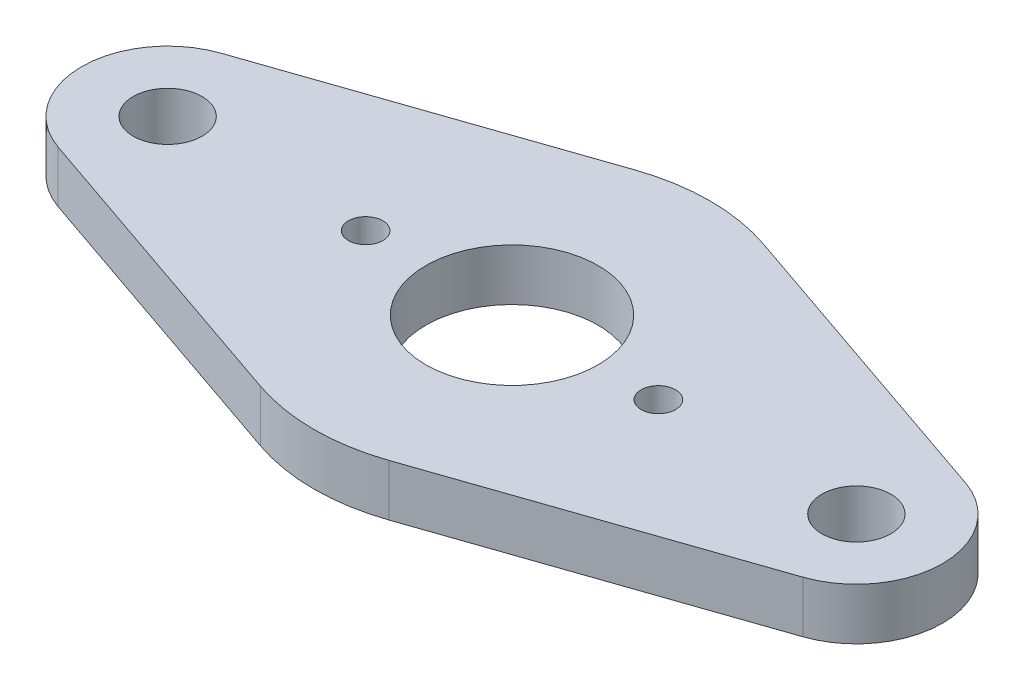
ISO-10303-21;
HEADER;
FILE_DESCRIPTION(('STEP AP214'),'2;1');
FILE_NAME('part.step','',(''),(''),'','','');
FILE_SCHEMA(('AUTOMOTIVE_DESIGN { 1 0 10303 214 1 1 1 1 }'));
ENDSEC;
DATA;
#1=APPLICATION_CONTEXT('core data for automotive mechanical design processes');
#2=APPLICATION_PROTOCOL_DEFINITION('international standard','automotive_design',2000,#1);
#3=PRODUCT_CONTEXT('',#1,'mechanical');
#4=PRODUCT('Part','Part','',(#3));
#5=PRODUCT_RELATED_PRODUCT_CATEGORY('part','',(#4));
#6=PRODUCT_DEFINITION_FORMATION('','',#4);
#7=PRODUCT_DEFINITION_CONTEXT('part definition',#1,'design');
#8=PRODUCT_DEFINITION('design','',#6,#7);
#9=PRODUCT_DEFINITION_SHAPE('','',#8);
#10=(LENGTH_UNIT() NAMED_UNIT(*) SI_UNIT(.MILLI.,.METRE.));
#11=(NAMED_UNIT(*) PLANE_ANGLE_UNIT() SI_UNIT($,.RADIAN.));
#12=(NAMED_UNIT(*) SI_UNIT($,.STERADIAN.) SOLID_ANGLE_UNIT());
#13=UNCERTAINTY_MEASURE_WITH_UNIT(LENGTH_MEASURE(1.E-05),#10,'distance_accuracy_value','');
#14=(GEOMETRIC_REPRESENTATION_CONTEXT(3) GLOBAL_UNCERTAINTY_ASSIGNED_CONTEXT((#13)) GLOBAL_UNIT_ASSIGNED_CONTEXT((#10,
#11,#12)) REPRESENTATION_CONTEXT('',''));
#15=CARTESIAN_POINT('',(0.,0.,0.));
#16=DIRECTION('',(0.,0.,1.));
#17=DIRECTION('',(1.,0.,0.));
#18=AXIS2_PLACEMENT_3D('',#15,#16,#17);
#19=CARTESIAN_POINT('',(-20.,3.,0.));
#20=DIRECTION('',(0.,1.,0.));
#21=DIRECTION('',(0.,0.,1.));
#22=AXIS2_PLACEMENT_3D('',#19,#20,#21);
#23=PLANE('',#22);
#24=CARTESIAN_POINT('',(20.,3.,0.));
#25=DIRECTION('',(0.,1.,0.));
#26=DIRECTION('',(0.,0.,-1.));
#27=AXIS2_PLACEMENT_3D('',#24,#25,#26);
#28=CIRCLE('',#27,2.);
#29=CARTESIAN_POINT('',(20.,3.,-2.));
#30=VERTEX_POINT('',#29);
#31=EDGE_CURVE('E198',#30,#30,#28,.T.);
#32=ORIENTED_EDGE('',*,*,#31,.F.);
#33=EDGE_LOOP('',(#32));
#34=FACE_BOUND('',#33,.T.);
#35=CARTESIAN_POINT('',(-20.,3.,0.));
#36=DIRECTION('',(0.,1.,0.));
#37=DIRECTION('',(0.,0.,1.));
#38=AXIS2_PLACEMENT_3D('',#35,#36,#37);
#39=CIRCLE('',#38,2.);
#40=CARTESIAN_POINT('',(-20.,3.,2.));
#41=VERTEX_POINT('',#40);
#42=EDGE_CURVE('E186',#41,#41,#39,.T.);
#43=ORIENTED_EDGE('',*,*,#42,.F.);
#44=EDGE_LOOP('',(#43));
#45=FACE_BOUND('',#44,.T.);
#46=CARTESIAN_POINT('',(-20.,3.,0.));
#47=DIRECTION('',(0.,1.,0.));
#48=DIRECTION('',(0.,0.,1.));
#49=AXIS2_PLACEMENT_3D('',#46,#47,#48);
#50=CIRCLE('',#49,5.);
#51=CARTESIAN_POINT('',(-21.625,3.,-4.72857007984443));
#52=VERTEX_POINT('',#51);
#53=CARTESIAN_POINT('',(-21.625,3.,4.72857007984444));
#54=VERTEX_POINT('',#53);
#55=EDGE_CURVE('E149',#52,#54,#50,.T.);
#56=ORIENTED_EDGE('',*,*,#55,.T.);
#57=DIRECTION('',(0.945714015968887,0.,0.325));
#58=VECTOR('',#57,1.);
#59=CARTESIAN_POINT('',(-21.625,3.,4.72857007984444));
#60=LINE('',#59,#58);
#61=CARTESIAN_POINT('',(-3.7375,3.,10.8757111836422));
#62=VERTEX_POINT('',#61);
#63=EDGE_CURVE('E97',#54,#62,#60,.T.);
#64=ORIENTED_EDGE('',*,*,#63,.T.);
#65=CARTESIAN_POINT('',(0.,3.,0.));
#66=DIRECTION('',(0.,1.,0.));
#67=DIRECTION('',(0.,0.,1.));
#68=AXIS2_PLACEMENT_3D('',#65,#66,#67);
#69=CIRCLE('',#68,11.5);
#70=CARTESIAN_POINT('',(3.7375,3.,10.8757111836422));
#71=VERTEX_POINT('',#70);
#72=EDGE_CURVE('E164',#62,#71,#69,.T.);
#73=ORIENTED_EDGE('',*,*,#72,.T.);
#74=DIRECTION('',(0.945714015968887,0.,-0.325));
#75=VECTOR('',#74,1.);
#76=CARTESIAN_POINT('',(21.625,3.,4.72857007984444));
#77=LINE('',#76,#75);
#78=CARTESIAN_POINT('',(21.625,3.,4.72857007984444));
#79=VERTEX_POINT('',#78);
#80=EDGE_CURVE('E177',#71,#79,#77,.T.);
#81=ORIENTED_EDGE('',*,*,#80,.T.);
#82=CARTESIAN_POINT('',(20.,3.,0.));
#83=DIRECTION('',(0.,1.,0.));
#84=DIRECTION('',(0.,0.,-1.));
#85=AXIS2_PLACEMENT_3D('',#82,#83,#84);
#86=CIRCLE('',#85,5.);
#87=CARTESIAN_POINT('',(21.625,3.,-4.72857007984443));
#88=VERTEX_POINT('',#87);
#89=EDGE_CURVE('E116',#79,#88,#86,.T.);
#90=ORIENTED_EDGE('',*,*,#89,.T.);
#91=DIRECTION('',(-0.945714015968887,0.,-0.325));
#92=VECTOR('',#91,1.);
#93=CARTESIAN_POINT('',(21.625,3.,-4.72857007984443));
#94=LINE('',#93,#92);
#95=CARTESIAN_POINT('',(3.7375,3.,-10.8757111836422));
#96=VERTEX_POINT('',#95);
#97=EDGE_CURVE('E110',#88,#96,#94,.T.);
#98=ORIENTED_EDGE('',*,*,#97,.T.);
#99=CARTESIAN_POINT('',(0.,3.,0.));
#100=DIRECTION('',(0.,1.,0.));
#101=DIRECTION('',(0.,0.,1.));
#102=AXIS2_PLACEMENT_3D('',#99,#100,#101);
#103=CIRCLE('',#102,11.5);
#104=CARTESIAN_POINT('',(-3.7375,3.,-10.8757111836422));
#105=VERTEX_POINT('',#104);
#106=EDGE_CURVE('E114',#96,#105,#103,.T.);
#107=ORIENTED_EDGE('',*,*,#106,.T.);
#108=DIRECTION('',(-0.945714015968887,0.,0.325));
#109=VECTOR('',#108,1.);
#110=CARTESIAN_POINT('',(-21.625,3.,-4.72857007984443));
#111=LINE('',#110,#109);
#112=EDGE_CURVE('E54',#105,#52,#111,.T.);
#113=ORIENTED_EDGE('',*,*,#112,.T.);
#114=EDGE_LOOP('',(#56,#64,#73,#81,#90,#98,#107,#113));
#115=FACE_BOUND('',#114,.T.);
#116=CARTESIAN_POINT('',(8.5,3.,0.));
#117=DIRECTION('',(0.,1.,0.));
#118=DIRECTION('',(0.,0.,-1.));
#119=AXIS2_PLACEMENT_3D('',#116,#117,#118);
#120=CIRCLE('',#119,1.);
#121=CARTESIAN_POINT('',(8.5,3.,-1.));
#122=VERTEX_POINT('',#121);
#123=EDGE_CURVE('E138',#122,#122,#120,.T.);
#124=ORIENTED_EDGE('',*,*,#123,.F.);
#125=EDGE_LOOP('',(#124));
#126=FACE_BOUND('',#125,.T.);
#127=CARTESIAN_POINT('',(-8.5,3.,0.));
#128=DIRECTION('',(0.,1.,0.));
#129=DIRECTION('',(0.,0.,1.));
#130=AXIS2_PLACEMENT_3D('',#127,#128,#129);
#131=CIRCLE('',#130,1.);
#132=CARTESIAN_POINT('',(-8.5,3.,1.));
#133=VERTEX_POINT('',#132);
#134=EDGE_CURVE('E192',#133,#133,#131,.T.);
#135=ORIENTED_EDGE('',*,*,#134,.F.);
#136=EDGE_LOOP('',(#135));
#137=FACE_BOUND('',#136,.T.);
#138=CARTESIAN_POINT('',(0.,3.,0.));
#139=DIRECTION('',(0.,1.,0.));
#140=DIRECTION('',(0.,0.,1.));
#141=AXIS2_PLACEMENT_3D('',#138,#139,#140);
#142=CIRCLE('',#141,5.);
#143=CARTESIAN_POINT('',(0.,3.,5.));
#144=VERTEX_POINT('',#143);
#145=EDGE_CURVE('E204',#144,#144,#142,.T.);
#146=ORIENTED_EDGE('',*,*,#145,.F.);
#147=EDGE_LOOP('',(#146));
#148=FACE_BOUND('',#147,.T.);
#149=ADVANCED_FACE('F37',(#34,#45,#115,#126,#137,#148),#23,.T.);
#150=CARTESIAN_POINT('',(-20.,0.,0.));
#151=DIRECTION('',(0.,1.,0.));
#152=DIRECTION('',(0.,0.,1.));
#153=AXIS2_PLACEMENT_3D('',#150,#151,#152);
#154=PLANE('',#153);
#155=CARTESIAN_POINT('',(-20.,0.,0.));
#156=DIRECTION('',(0.,1.,0.));
#157=DIRECTION('',(0.,0.,1.));
#158=AXIS2_PLACEMENT_3D('',#155,#156,#157);
#159=CIRCLE('',#158,5.);
#160=CARTESIAN_POINT('',(-21.625,0.,-4.72857007984443));
#161=VERTEX_POINT('',#160);
#162=CARTESIAN_POINT('',(-21.625,0.,4.72857007984444));
#163=VERTEX_POINT('',#162);
#164=EDGE_CURVE('E134',#161,#163,#159,.T.);
#165=ORIENTED_EDGE('',*,*,#164,.F.);
#166=DIRECTION('',(-0.945714015968887,0.,0.325));
#167=VECTOR('',#166,1.);
#168=CARTESIAN_POINT('',(-21.625,0.,-4.72857007984443));
#169=LINE('',#168,#167);
#170=CARTESIAN_POINT('',(-3.7375,0.,-10.8757111836422));
#171=VERTEX_POINT('',#170);
#172=EDGE_CURVE('E89',#171,#161,#169,.T.);
#173=ORIENTED_EDGE('',*,*,#172,.F.);
#174=CARTESIAN_POINT('',(0.,0.,0.));
#175=DIRECTION('',(0.,1.,0.));
#176=DIRECTION('',(0.,0.,1.));
#177=AXIS2_PLACEMENT_3D('',#174,#175,#176);
#178=CIRCLE('',#177,11.5);
#179=CARTESIAN_POINT('',(3.7375,0.,-10.8757111836422));
#180=VERTEX_POINT('',#179);
#181=EDGE_CURVE('E83',#180,#171,#178,.T.);
#182=ORIENTED_EDGE('',*,*,#181,.F.);
#183=DIRECTION('',(-0.945714015968887,0.,-0.325));
#184=VECTOR('',#183,1.);
#185=CARTESIAN_POINT('',(21.625,0.,-4.72857007984443));
#186=LINE('',#185,#184);
#187=CARTESIAN_POINT('',(21.625,0.,-4.72857007984443));
#188=VERTEX_POINT('',#187);
#189=EDGE_CURVE('E124',#188,#180,#186,.T.);
#190=ORIENTED_EDGE('',*,*,#189,.F.);
#191=CARTESIAN_POINT('',(20.,0.,0.));
#192=DIRECTION('',(0.,1.,0.));
#193=DIRECTION('',(0.,0.,-1.));
#194=AXIS2_PLACEMENT_3D('',#191,#192,#193);
#195=CIRCLE('',#194,5.);
#196=CARTESIAN_POINT('',(21.625,0.,4.72857007984444));
#197=VERTEX_POINT('',#196);
#198=EDGE_CURVE('E144',#197,#188,#195,.T.);
#199=ORIENTED_EDGE('',*,*,#198,.F.);
#200=DIRECTION('',(0.945714015968887,0.,-0.325));
#201=VECTOR('',#200,1.);
#202=CARTESIAN_POINT('',(21.625,0.,4.72857007984444));
#203=LINE('',#202,#201);
#204=CARTESIAN_POINT('',(3.7375,0.,10.8757111836422));
#205=VERTEX_POINT('',#204);
#206=EDGE_CURVE('E142',#205,#197,#203,.T.);
#207=ORIENTED_EDGE('',*,*,#206,.F.);
#208=CARTESIAN_POINT('',(0.,0.,0.));
#209=DIRECTION('',(0.,1.,0.));
#210=DIRECTION('',(0.,0.,1.));
#211=AXIS2_PLACEMENT_3D('',#208,#209,#210);
#212=CIRCLE('',#211,11.5);
#213=CARTESIAN_POINT('',(-3.7375,0.,10.8757111836422));
#214=VERTEX_POINT('',#213);
#215=EDGE_CURVE('E140',#214,#205,#212,.T.);
#216=ORIENTED_EDGE('',*,*,#215,.F.);
#217=DIRECTION('',(0.945714015968887,0.,0.325));
#218=VECTOR('',#217,1.);
#219=CARTESIAN_POINT('',(-21.625,0.,4.72857007984444));
#220=LINE('',#219,#218);
#221=EDGE_CURVE('E137',#163,#214,#220,.T.);
#222=ORIENTED_EDGE('',*,*,#221,.F.);
#223=EDGE_LOOP('',(#165,#173,#182,#190,#199,#207,#216,#222));
#224=FACE_BOUND('',#223,.T.);
#225=CARTESIAN_POINT('',(8.5,0.,0.));
#226=DIRECTION('',(0.,1.,0.));
#227=DIRECTION('',(0.,0.,-1.));
#228=AXIS2_PLACEMENT_3D('',#225,#226,#227);
#229=CIRCLE('',#228,1.);
#230=CARTESIAN_POINT('',(8.5,0.,-1.));
#231=VERTEX_POINT('',#230);
#232=EDGE_CURVE('E183',#231,#231,#229,.T.);
#233=ORIENTED_EDGE('',*,*,#232,.T.);
#234=EDGE_LOOP('',(#233));
#235=FACE_BOUND('',#234,.T.);
#236=CARTESIAN_POINT('',(-20.,0.,0.));
#237=DIRECTION('',(0.,1.,0.));
#238=DIRECTION('',(0.,0.,1.));
#239=AXIS2_PLACEMENT_3D('',#236,#237,#238);
#240=CIRCLE('',#239,2.);
#241=CARTESIAN_POINT('',(-20.,0.,2.));
#242=VERTEX_POINT('',#241);
#243=EDGE_CURVE('E189',#242,#242,#240,.T.);
#244=ORIENTED_EDGE('',*,*,#243,.T.);
#245=EDGE_LOOP('',(#244));
#246=FACE_BOUND('',#245,.T.);
#247=CARTESIAN_POINT('',(-8.5,0.,0.));
#248=DIRECTION('',(0.,1.,0.));
#249=DIRECTION('',(0.,0.,1.));
#250=AXIS2_PLACEMENT_3D('',#247,#248,#249);
#251=CIRCLE('',#250,1.);
#252=CARTESIAN_POINT('',(-8.5,0.,1.));
#253=VERTEX_POINT('',#252);
#254=EDGE_CURVE('E195',#253,#253,#251,.T.);
#255=ORIENTED_EDGE('',*,*,#254,.T.);
#256=EDGE_LOOP('',(#255));
#257=FACE_BOUND('',#256,.T.);
#258=CARTESIAN_POINT('',(20.,0.,0.));
#259=DIRECTION('',(0.,1.,0.));
#260=DIRECTION('',(0.,0.,-1.));
#261=AXIS2_PLACEMENT_3D('',#258,#259,#260);
#262=CIRCLE('',#261,2.);
#263=CARTESIAN_POINT('',(20.,0.,-2.));
#264=VERTEX_POINT('',#263);
#265=EDGE_CURVE('E201',#264,#264,#262,.T.);
#266=ORIENTED_EDGE('',*,*,#265,.T.);
#267=EDGE_LOOP('',(#266));
#268=FACE_BOUND('',#267,.T.);
#269=CARTESIAN_POINT('',(0.,0.,0.));
#270=DIRECTION('',(0.,1.,0.));
#271=DIRECTION('',(0.,0.,1.));
#272=AXIS2_PLACEMENT_3D('',#269,#270,#271);
#273=CIRCLE('',#272,5.);
#274=CARTESIAN_POINT('',(0.,0.,5.));
#275=VERTEX_POINT('',#274);
#276=EDGE_CURVE('E207',#275,#275,#273,.T.);
#277=ORIENTED_EDGE('',*,*,#276,.T.);
#278=EDGE_LOOP('',(#277));
#279=FACE_BOUND('',#278,.T.);
#280=ADVANCED_FACE('F168',(#224,#235,#246,#257,#268,#279),#154,.F.);
#281=CARTESIAN_POINT('',(-20.,3.,0.));
#282=DIRECTION('',(0.,-1.,0.));
#283=DIRECTION('',(0.,0.,-1.));
#284=AXIS2_PLACEMENT_3D('',#281,#282,#283);
#285=CYLINDRICAL_SURFACE('',#284,5.);
#286=ORIENTED_EDGE('',*,*,#164,.T.);
#287=DIRECTION('',(0.,-1.,0.));
#288=VECTOR('',#287,1.);
#289=CARTESIAN_POINT('',(-21.625,3.,4.72857007984444));
#290=LINE('',#289,#288);
#291=EDGE_CURVE('E11',#54,#163,#290,.T.);
#292=ORIENTED_EDGE('',*,*,#291,.F.);
#293=ORIENTED_EDGE('',*,*,#55,.F.);
#294=DIRECTION('',(0.,-1.,0.));
#295=VECTOR('',#294,1.);
#296=CARTESIAN_POINT('',(-21.625,3.,-4.72857007984443));
#297=LINE('',#296,#295);
#298=EDGE_CURVE('E130',#52,#161,#297,.T.);
#299=ORIENTED_EDGE('',*,*,#298,.T.);
#300=EDGE_LOOP('',(#286,#292,#293,#299));
#301=FACE_BOUND('',#300,.T.);
#302=ADVANCED_FACE('F39',(#301),#285,.T.);
#303=CARTESIAN_POINT('',(-21.625,3.,4.72857007984444));
#304=DIRECTION('',(0.325,0.,-0.945714015968887));
#305=DIRECTION('',(-0.945714015968887,0.,-0.325));
#306=AXIS2_PLACEMENT_3D('',#303,#304,#305);
#307=PLANE('',#306);
#308=ORIENTED_EDGE('',*,*,#221,.T.);
#309=DIRECTION('',(0.,-1.,0.));
#310=VECTOR('',#309,1.);
#311=CARTESIAN_POINT('',(-3.7375,3.,10.8757111836422));
#312=LINE('',#311,#310);
#313=EDGE_CURVE('E46',#62,#214,#312,.T.);
#314=ORIENTED_EDGE('',*,*,#313,.F.);
#315=ORIENTED_EDGE('',*,*,#63,.F.);
#316=ORIENTED_EDGE('',*,*,#291,.T.);
#317=EDGE_LOOP('',(#308,#314,#315,#316));
#318=FACE_BOUND('',#317,.T.);
#319=ADVANCED_FACE('F241',(#318),#307,.F.);
#320=CARTESIAN_POINT('',(0.,3.,0.));
#321=DIRECTION('',(0.,-1.,0.));
#322=DIRECTION('',(0.,0.,-1.));
#323=AXIS2_PLACEMENT_3D('',#320,#321,#322);
#324=CYLINDRICAL_SURFACE('',#323,11.5);
#325=ORIENTED_EDGE('',*,*,#215,.T.);
#326=DIRECTION('',(0.,-1.,0.));
#327=VECTOR('',#326,1.);
#328=CARTESIAN_POINT('',(3.7375,3.,10.8757111836422));
#329=LINE('',#328,#327);
#330=EDGE_CURVE('E156',#71,#205,#329,.T.);
#331=ORIENTED_EDGE('',*,*,#330,.F.);
#332=ORIENTED_EDGE('',*,*,#72,.F.);
#333=ORIENTED_EDGE('',*,*,#313,.T.);
#334=EDGE_LOOP('',(#325,#331,#332,#333));
#335=FACE_BOUND('',#334,.T.);
#336=ADVANCED_FACE('F162',(#335),#324,.T.);
#337=CARTESIAN_POINT('',(21.625,3.,4.72857007984444));
#338=DIRECTION('',(-0.325,0.,-0.945714015968887));
#339=DIRECTION('',(-0.945714015968887,0.,0.325));
#340=AXIS2_PLACEMENT_3D('',#337,#338,#339);
#341=PLANE('',#340);
#342=ORIENTED_EDGE('',*,*,#206,.T.);
#343=DIRECTION('',(0.,-1.,0.));
#344=VECTOR('',#343,1.);
#345=CARTESIAN_POINT('',(21.625,3.,4.72857007984444));
#346=LINE('',#345,#344);
#347=EDGE_CURVE('E153',#79,#197,#346,.T.);
#348=ORIENTED_EDGE('',*,*,#347,.F.);
#349=ORIENTED_EDGE('',*,*,#80,.F.);
#350=ORIENTED_EDGE('',*,*,#330,.T.);
#351=EDGE_LOOP('',(#342,#348,#349,#350));
#352=FACE_BOUND('',#351,.T.);
#353=ADVANCED_FACE('F173',(#352),#341,.F.);
#354=CARTESIAN_POINT('',(20.,3.,0.));
#355=DIRECTION('',(0.,-1.,0.));
#356=DIRECTION('',(0.,0.,-1.));
#357=AXIS2_PLACEMENT_3D('',#354,#355,#356);
#358=CYLINDRICAL_SURFACE('',#357,5.);
#359=ORIENTED_EDGE('',*,*,#198,.T.);
#360=DIRECTION('',(0.,-1.,0.));
#361=VECTOR('',#360,1.);
#362=CARTESIAN_POINT('',(21.625,3.,-4.72857007984443));
#363=LINE('',#362,#361);
#364=EDGE_CURVE('E125',#88,#188,#363,.T.);
#365=ORIENTED_EDGE('',*,*,#364,.F.);
#366=ORIENTED_EDGE('',*,*,#89,.F.);
#367=ORIENTED_EDGE('',*,*,#347,.T.);
#368=EDGE_LOOP('',(#359,#365,#366,#367));
#369=FACE_BOUND('',#368,.T.);
#370=ADVANCED_FACE('F176',(#369),#358,.T.);
#371=CARTESIAN_POINT('',(21.625,3.,-4.72857007984443));
#372=DIRECTION('',(-0.325,0.,0.945714015968887));
#373=DIRECTION('',(0.945714015968887,0.,0.325));
#374=AXIS2_PLACEMENT_3D('',#371,#372,#373);
#375=PLANE('',#374);
#376=ORIENTED_EDGE('',*,*,#189,.T.);
#377=DIRECTION('',(0.,-1.,0.));
#378=VECTOR('',#377,1.);
#379=CARTESIAN_POINT('',(3.7375,3.,-10.8757111836422));
#380=LINE('',#379,#378);
#381=EDGE_CURVE('E121',#96,#180,#380,.T.);
#382=ORIENTED_EDGE('',*,*,#381,.F.);
#383=ORIENTED_EDGE('',*,*,#97,.F.);
#384=ORIENTED_EDGE('',*,*,#364,.T.);
#385=EDGE_LOOP('',(#376,#382,#383,#384));
#386=FACE_BOUND('',#385,.T.);
#387=ADVANCED_FACE('F122',(#386),#375,.F.);
#388=CARTESIAN_POINT('',(0.,3.,0.));
#389=DIRECTION('',(0.,-1.,0.));
#390=DIRECTION('',(0.,0.,-1.));
#391=AXIS2_PLACEMENT_3D('',#388,#389,#390);
#392=CYLINDRICAL_SURFACE('',#391,11.5);
#393=ORIENTED_EDGE('',*,*,#181,.T.);
#394=DIRECTION('',(0.,-1.,0.));
#395=VECTOR('',#394,1.);
#396=CARTESIAN_POINT('',(-3.7375,3.,-10.8757111836422));
#397=LINE('',#396,#395);
#398=EDGE_CURVE('E126',#105,#171,#397,.T.);
#399=ORIENTED_EDGE('',*,*,#398,.F.);
#400=ORIENTED_EDGE('',*,*,#106,.F.);
#401=ORIENTED_EDGE('',*,*,#381,.T.);
#402=EDGE_LOOP('',(#393,#399,#400,#401));
#403=FACE_BOUND('',#402,.T.);
#404=ADVANCED_FACE('F128',(#403),#392,.T.);
#405=CARTESIAN_POINT('',(-21.625,3.,-4.72857007984443));
#406=DIRECTION('',(0.325,0.,0.945714015968887));
#407=DIRECTION('',(0.945714015968887,0.,-0.325));
#408=AXIS2_PLACEMENT_3D('',#405,#406,#407);
#409=PLANE('',#408);
#410=ORIENTED_EDGE('',*,*,#172,.T.);
#411=ORIENTED_EDGE('',*,*,#298,.F.);
#412=ORIENTED_EDGE('',*,*,#112,.F.);
#413=ORIENTED_EDGE('',*,*,#398,.T.);
#414=EDGE_LOOP('',(#410,#411,#412,#413));
#415=FACE_BOUND('',#414,.T.);
#416=ADVANCED_FACE('F229',(#415),#409,.F.);
#417=CARTESIAN_POINT('',(8.5,3.,0.));
#418=DIRECTION('',(0.,-1.,0.));
#419=DIRECTION('',(0.,0.,-1.));
#420=AXIS2_PLACEMENT_3D('',#417,#418,#419);
#421=CYLINDRICAL_SURFACE('',#420,1.);
#422=ORIENTED_EDGE('',*,*,#123,.T.);
#423=EDGE_LOOP('',(#422));
#424=FACE_BOUND('',#423,.T.);
#425=ORIENTED_EDGE('',*,*,#232,.F.);
#426=EDGE_LOOP('',(#425));
#427=FACE_BOUND('',#426,.T.);
#428=ADVANCED_FACE('F226',(#424,#427),#421,.F.);
#429=CARTESIAN_POINT('',(-20.,3.,0.));
#430=DIRECTION('',(0.,-1.,0.));
#431=DIRECTION('',(0.,0.,-1.));
#432=AXIS2_PLACEMENT_3D('',#429,#430,#431);
#433=CYLINDRICAL_SURFACE('',#432,2.);
#434=ORIENTED_EDGE('',*,*,#42,.T.);
#435=EDGE_LOOP('',(#434));
#436=FACE_BOUND('',#435,.T.);
#437=ORIENTED_EDGE('',*,*,#243,.F.);
#438=EDGE_LOOP('',(#437));
#439=FACE_BOUND('',#438,.T.);
#440=ADVANCED_FACE('F305',(#436,#439),#433,.F.);
#441=CARTESIAN_POINT('',(-8.5,3.,0.));
#442=DIRECTION('',(0.,-1.,0.));
#443=DIRECTION('',(0.,0.,-1.));
#444=AXIS2_PLACEMENT_3D('',#441,#442,#443);
#445=CYLINDRICAL_SURFACE('',#444,1.);
#446=ORIENTED_EDGE('',*,*,#134,.T.);
#447=EDGE_LOOP('',(#446));
#448=FACE_BOUND('',#447,.T.);
#449=ORIENTED_EDGE('',*,*,#254,.F.);
#450=EDGE_LOOP('',(#449));
#451=FACE_BOUND('',#450,.T.);
#452=ADVANCED_FACE('F313',(#448,#451),#445,.F.);
#453=CARTESIAN_POINT('',(20.,3.,0.));
#454=DIRECTION('',(0.,-1.,0.));
#455=DIRECTION('',(0.,0.,-1.));
#456=AXIS2_PLACEMENT_3D('',#453,#454,#455);
#457=CYLINDRICAL_SURFACE('',#456,2.);
#458=ORIENTED_EDGE('',*,*,#31,.T.);
#459=EDGE_LOOP('',(#458));
#460=FACE_BOUND('',#459,.T.);
#461=ORIENTED_EDGE('',*,*,#265,.F.);
#462=EDGE_LOOP('',(#461));
#463=FACE_BOUND('',#462,.T.);
#464=ADVANCED_FACE('F321',(#460,#463),#457,.F.);
#465=CARTESIAN_POINT('',(0.,3.,0.));
#466=DIRECTION('',(0.,-1.,0.));
#467=DIRECTION('',(0.,0.,-1.));
#468=AXIS2_PLACEMENT_3D('',#465,#466,#467);
#469=CYLINDRICAL_SURFACE('',#468,5.);
#470=ORIENTED_EDGE('',*,*,#145,.T.);
#471=EDGE_LOOP('',(#470));
#472=FACE_BOUND('',#471,.T.);
#473=ORIENTED_EDGE('',*,*,#276,.F.);
#474=EDGE_LOOP('',(#473));
#475=FACE_BOUND('',#474,.T.);
#476=ADVANCED_FACE('F213',(#472,#475),#469,.F.);
#477=CLOSED_SHELL('',(#149,#280,#302,#319,#336,#353,#370,#387,#404,#416,#428,#440,#452,#464,#476));
#478=MANIFOLD_SOLID_BREP('B2',#477);
#479=ADVANCED_BREP_SHAPE_REPRESENTATION('',(#18,#478),#14);
#480=SHAPE_DEFINITION_REPRESENTATION(#9,#479);
ENDSEC;
END-ISO-10303-21;
